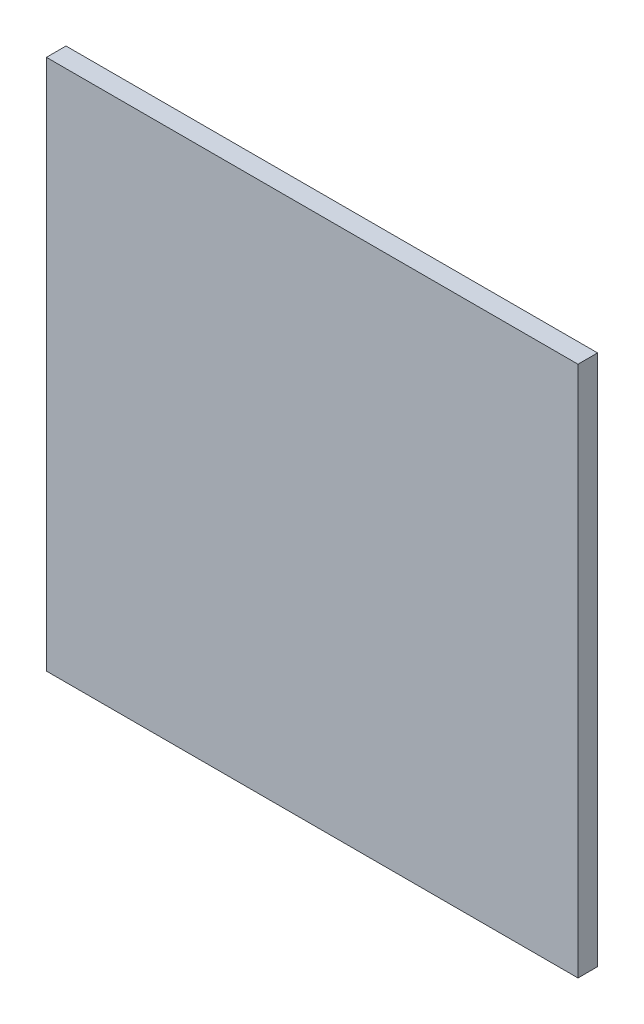
ISO-10303-21;
HEADER;
FILE_DESCRIPTION(('STEP AP214'),'2;1');
FILE_NAME('part.step','',(''),(''),'','','');
FILE_SCHEMA(('AUTOMOTIVE_DESIGN { 1 0 10303 214 1 1 1 1 }'));
ENDSEC;
DATA;
#1=APPLICATION_CONTEXT('core data for automotive mechanical design processes');
#2=APPLICATION_PROTOCOL_DEFINITION('international standard','automotive_design',2000,#1);
#3=PRODUCT_CONTEXT('',#1,'mechanical');
#4=PRODUCT('Part','Part','',(#3));
#5=PRODUCT_RELATED_PRODUCT_CATEGORY('part','',(#4));
#6=PRODUCT_DEFINITION_FORMATION('','',#4);
#7=PRODUCT_DEFINITION_CONTEXT('part definition',#1,'design');
#8=PRODUCT_DEFINITION('design','',#6,#7);
#9=PRODUCT_DEFINITION_SHAPE('','',#8);
#10=(LENGTH_UNIT() NAMED_UNIT(*) SI_UNIT(.MILLI.,.METRE.));
#11=(NAMED_UNIT(*) PLANE_ANGLE_UNIT() SI_UNIT($,.RADIAN.));
#12=(NAMED_UNIT(*) SI_UNIT($,.STERADIAN.) SOLID_ANGLE_UNIT());
#13=UNCERTAINTY_MEASURE_WITH_UNIT(LENGTH_MEASURE(1.E-05),#10,'distance_accuracy_value','');
#14=(GEOMETRIC_REPRESENTATION_CONTEXT(3) GLOBAL_UNCERTAINTY_ASSIGNED_CONTEXT((#13)) GLOBAL_UNIT_ASSIGNED_CONTEXT((#10,
#11,#12)) REPRESENTATION_CONTEXT('',''));
#15=CARTESIAN_POINT('',(0.,0.,0.));
#16=DIRECTION('',(0.,0.,1.));
#17=DIRECTION('',(1.,0.,0.));
#18=AXIS2_PLACEMENT_3D('',#15,#16,#17);
#19=CARTESIAN_POINT('',(5.23914324941507,30.6898566603446,-0.822200089693));
#20=DIRECTION('',(1.,0.,0.));
#21=DIRECTION('',(0.,1.,0.));
#22=AXIS2_PLACEMENT_3D('',#19,#20,#21);
#23=PLANE('',#22);
#24=DIRECTION('',(0.,1.,0.));
#25=VECTOR('',#24,1.);
#26=CARTESIAN_POINT('',(5.23914324941507,30.6898566603446,0.177799910307));
#27=LINE('',#26,#25);
#28=CARTESIAN_POINT('',(5.23914324941507,3.55074298980373,0.177799910307));
#29=VERTEX_POINT('',#28);
#30=CARTESIAN_POINT('',(5.23914324941507,30.6898566603446,0.177799910307));
#31=VERTEX_POINT('',#30);
#32=EDGE_CURVE('E104',#29,#31,#27,.T.);
#33=ORIENTED_EDGE('',*,*,#32,.T.);
#34=DIRECTION('',(0.,0.,1.));
#35=VECTOR('',#34,1.);
#36=CARTESIAN_POINT('',(5.23914324941507,30.6898566603446,-0.822200089693));
#37=LINE('',#36,#35);
#38=CARTESIAN_POINT('',(5.23914324941507,30.6898566603446,-0.822200089693));
#39=VERTEX_POINT('',#38);
#40=EDGE_CURVE('E11',#39,#31,#37,.T.);
#41=ORIENTED_EDGE('',*,*,#40,.F.);
#42=DIRECTION('',(0.,1.,0.));
#43=VECTOR('',#42,1.);
#44=CARTESIAN_POINT('',(5.23914324941507,30.6898566603446,-0.822200089693));
#45=LINE('',#44,#43);
#46=CARTESIAN_POINT('',(5.23914324941507,3.55074298980373,-0.822200089693));
#47=VERTEX_POINT('',#46);
#48=EDGE_CURVE('E92',#47,#39,#45,.T.);
#49=ORIENTED_EDGE('',*,*,#48,.F.);
#50=DIRECTION('',(0.,0.,1.));
#51=VECTOR('',#50,1.);
#52=CARTESIAN_POINT('',(5.23914324941507,3.55074298980373,-0.822200089693));
#53=LINE('',#52,#51);
#54=EDGE_CURVE('E100',#47,#29,#53,.T.);
#55=ORIENTED_EDGE('',*,*,#54,.T.);
#56=EDGE_LOOP('',(#33,#41,#49,#55));
#57=FACE_BOUND('',#56,.T.);
#58=ADVANCED_FACE('F41',(#57),#23,.F.);
#59=CARTESIAN_POINT('',(5.23914324941507,30.6898566603446,-0.822200089693));
#60=DIRECTION('',(0.,-1.,0.));
#61=DIRECTION('',(1.,0.,0.));
#62=AXIS2_PLACEMENT_3D('',#59,#60,#61);
#63=PLANE('',#62);
#64=DIRECTION('',(1.,0.,0.));
#65=VECTOR('',#64,1.);
#66=CARTESIAN_POINT('',(5.23914324941507,30.6898566603446,0.177799910307));
#67=LINE('',#66,#65);
#68=CARTESIAN_POINT('',(32.3782569199559,30.6898566603446,0.177799910307));
#69=VERTEX_POINT('',#68);
#70=EDGE_CURVE('E96',#31,#69,#67,.T.);
#71=ORIENTED_EDGE('',*,*,#70,.T.);
#72=DIRECTION('',(0.,0.,1.));
#73=VECTOR('',#72,1.);
#74=CARTESIAN_POINT('',(32.3782569199559,30.6898566603446,-0.822200089693));
#75=LINE('',#74,#73);
#76=CARTESIAN_POINT('',(32.3782569199559,30.6898566603446,-0.822200089693));
#77=VERTEX_POINT('',#76);
#78=EDGE_CURVE('E49',#77,#69,#75,.T.);
#79=ORIENTED_EDGE('',*,*,#78,.F.);
#80=DIRECTION('',(1.,0.,0.));
#81=VECTOR('',#80,1.);
#82=CARTESIAN_POINT('',(5.23914324941507,30.6898566603446,-0.822200089693));
#83=LINE('',#82,#81);
#84=EDGE_CURVE('E87',#39,#77,#83,.T.);
#85=ORIENTED_EDGE('',*,*,#84,.F.);
#86=ORIENTED_EDGE('',*,*,#40,.T.);
#87=EDGE_LOOP('',(#71,#79,#85,#86));
#88=FACE_BOUND('',#87,.T.);
#89=ADVANCED_FACE('F95',(#88),#63,.F.);
#90=CARTESIAN_POINT('',(32.3782569199559,30.6898566603446,-0.822200089693));
#91=DIRECTION('',(-1.,0.,0.));
#92=DIRECTION('',(0.,-1.,0.));
#93=AXIS2_PLACEMENT_3D('',#90,#91,#92);
#94=PLANE('',#93);
#95=DIRECTION('',(0.,-1.,0.));
#96=VECTOR('',#95,1.);
#97=CARTESIAN_POINT('',(32.3782569199559,30.6898566603446,0.177799910307));
#98=LINE('',#97,#96);
#99=CARTESIAN_POINT('',(32.3782569199559,3.55074298980373,0.177799910307));
#100=VERTEX_POINT('',#99);
#101=EDGE_CURVE('E74',#69,#100,#98,.T.);
#102=ORIENTED_EDGE('',*,*,#101,.T.);
#103=DIRECTION('',(0.,0.,1.));
#104=VECTOR('',#103,1.);
#105=CARTESIAN_POINT('',(32.3782569199559,3.55074298980373,-0.822200089693));
#106=LINE('',#105,#104);
#107=CARTESIAN_POINT('',(32.3782569199559,3.55074298980373,-0.822200089693));
#108=VERTEX_POINT('',#107);
#109=EDGE_CURVE('E97',#108,#100,#106,.T.);
#110=ORIENTED_EDGE('',*,*,#109,.F.);
#111=DIRECTION('',(0.,-1.,0.));
#112=VECTOR('',#111,1.);
#113=CARTESIAN_POINT('',(32.3782569199559,30.6898566603446,-0.822200089693));
#114=LINE('',#113,#112);
#115=EDGE_CURVE('E90',#77,#108,#114,.T.);
#116=ORIENTED_EDGE('',*,*,#115,.F.);
#117=ORIENTED_EDGE('',*,*,#78,.T.);
#118=EDGE_LOOP('',(#102,#110,#116,#117));
#119=FACE_BOUND('',#118,.T.);
#120=ADVANCED_FACE('F98',(#119),#94,.F.);
#121=CARTESIAN_POINT('',(5.23914324941507,3.55074298980373,-0.822200089693));
#122=DIRECTION('',(0.,1.,0.));
#123=DIRECTION('',(-1.,0.,0.));
#124=AXIS2_PLACEMENT_3D('',#121,#122,#123);
#125=PLANE('',#124);
#126=DIRECTION('',(-1.,0.,0.));
#127=VECTOR('',#126,1.);
#128=CARTESIAN_POINT('',(5.23914324941507,3.55074298980373,0.177799910307));
#129=LINE('',#128,#127);
#130=EDGE_CURVE('E80',#100,#29,#129,.T.);
#131=ORIENTED_EDGE('',*,*,#130,.T.);
#132=ORIENTED_EDGE('',*,*,#54,.F.);
#133=DIRECTION('',(-1.,0.,0.));
#134=VECTOR('',#133,1.);
#135=CARTESIAN_POINT('',(5.23914324941507,3.55074298980373,-0.822200089693));
#136=LINE('',#135,#134);
#137=EDGE_CURVE('E57',#108,#47,#136,.T.);
#138=ORIENTED_EDGE('',*,*,#137,.F.);
#139=ORIENTED_EDGE('',*,*,#109,.T.);
#140=EDGE_LOOP('',(#131,#132,#138,#139));
#141=FACE_BOUND('',#140,.T.);
#142=ADVANCED_FACE('F111',(#141),#125,.F.);
#143=CARTESIAN_POINT('',(0.,0.,-0.822200089693));
#144=DIRECTION('',(0.,0.,1.));
#145=DIRECTION('',(1.,0.,0.));
#146=AXIS2_PLACEMENT_3D('',#143,#144,#145);
#147=PLANE('',#146);
#148=ORIENTED_EDGE('',*,*,#48,.T.);
#149=ORIENTED_EDGE('',*,*,#84,.T.);
#150=ORIENTED_EDGE('',*,*,#115,.T.);
#151=ORIENTED_EDGE('',*,*,#137,.T.);
#152=EDGE_LOOP('',(#148,#149,#150,#151));
#153=FACE_BOUND('',#152,.T.);
#154=ADVANCED_FACE('F88',(#153),#147,.F.);
#155=CARTESIAN_POINT('',(0.,0.,0.177799910307));
#156=DIRECTION('',(0.,0.,1.));
#157=DIRECTION('',(1.,0.,0.));
#158=AXIS2_PLACEMENT_3D('',#155,#156,#157);
#159=PLANE('',#158);
#160=ORIENTED_EDGE('',*,*,#32,.F.);
#161=ORIENTED_EDGE('',*,*,#130,.F.);
#162=ORIENTED_EDGE('',*,*,#101,.F.);
#163=ORIENTED_EDGE('',*,*,#70,.F.);
#164=EDGE_LOOP('',(#160,#161,#162,#163));
#165=FACE_BOUND('',#164,.T.);
#166=ADVANCED_FACE('F114',(#165),#159,.T.);
#167=CLOSED_SHELL('',(#58,#89,#120,#142,#154,#166));
#168=MANIFOLD_SOLID_BREP('B2',#167);
#169=ADVANCED_BREP_SHAPE_REPRESENTATION('',(#18,#168),#14);
#170=SHAPE_DEFINITION_REPRESENTATION(#9,#169);
ENDSEC;
END-ISO-10303-21;
